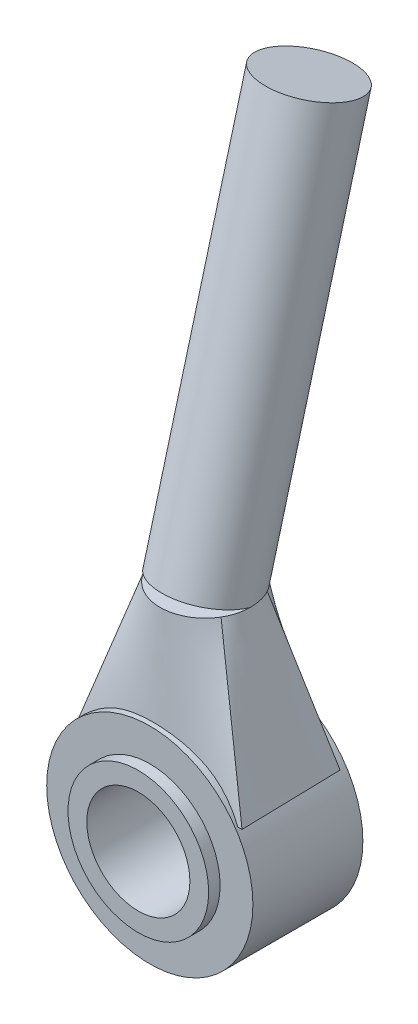
ISO-10303-21;
HEADER;
FILE_DESCRIPTION(('STEP AP214'),'2;1');
FILE_NAME('part.step','',(''),(''),'','','');
FILE_SCHEMA(('AUTOMOTIVE_DESIGN { 1 0 10303 214 1 1 1 1 }'));
ENDSEC;
DATA;
#1=APPLICATION_CONTEXT('core data for automotive mechanical design processes');
#2=APPLICATION_PROTOCOL_DEFINITION('international standard','automotive_design',2000,#1);
#3=PRODUCT_CONTEXT('',#1,'mechanical');
#4=PRODUCT('Part','Part','',(#3));
#5=PRODUCT_RELATED_PRODUCT_CATEGORY('part','',(#4));
#6=PRODUCT_DEFINITION_FORMATION('','',#4);
#7=PRODUCT_DEFINITION_CONTEXT('part definition',#1,'design');
#8=PRODUCT_DEFINITION('design','',#6,#7);
#9=PRODUCT_DEFINITION_SHAPE('','',#8);
#10=(LENGTH_UNIT() NAMED_UNIT(*) SI_UNIT(.MILLI.,.METRE.));
#11=(NAMED_UNIT(*) PLANE_ANGLE_UNIT() SI_UNIT($,.RADIAN.));
#12=(NAMED_UNIT(*) SI_UNIT($,.STERADIAN.) SOLID_ANGLE_UNIT());
#13=UNCERTAINTY_MEASURE_WITH_UNIT(LENGTH_MEASURE(1.E-05),#10,'distance_accuracy_value','');
#14=(GEOMETRIC_REPRESENTATION_CONTEXT(3) GLOBAL_UNCERTAINTY_ASSIGNED_CONTEXT((#13)) GLOBAL_UNIT_ASSIGNED_CONTEXT((#10,
#11,#12)) REPRESENTATION_CONTEXT('',''));
#15=CARTESIAN_POINT('',(0.,0.,0.));
#16=DIRECTION('',(0.,0.,1.));
#17=DIRECTION('',(1.,0.,0.));
#18=AXIS2_PLACEMENT_3D('',#15,#16,#17);
#19=CARTESIAN_POINT('',(-13.8705400464687,10.,1.27208405467628));
#20=CARTESIAN_POINT('',(-6.74020300797196,35.,5.51659180685527));
#21=CARTESIAN_POINT('',(-13.8705400464687,10.,2.7332602371845));
#22=CARTESIAN_POINT('',(-7.0839856706328,35.,6.09243536011873));
#23=CARTESIAN_POINT('',(-13.8705400464687,10.,4.19443641969272));
#24=CARTESIAN_POINT('',(-7.36534175506872,35.,6.73415605144016));
#25=CARTESIAN_POINT('',(-13.8705400464687,10.,7.11678878470916));
#26=CARTESIAN_POINT('',(-7.74869441974719,35.,8.09770033490436));
#27=CARTESIAN_POINT('',(-13.8705400464687,10.,8.57796496721738));
#28=CARTESIAN_POINT('',(-7.85,35.,8.81886912074885));
#29=CARTESIAN_POINT('',(-13.8705400464687,10.,11.5003173322338));
#30=CARTESIAN_POINT('',(-7.85,35.,10.2622119603318));
#31=CARTESIAN_POINT('',(-13.8705400464687,10.,12.961493514742));
#32=CARTESIAN_POINT('',(-7.74869441974719,35.,10.9833807461763));
#33=CARTESIAN_POINT('',(-13.8705400464687,10.,15.8838458797585));
#34=CARTESIAN_POINT('',(-7.36534175506873,35.,12.3469250296405));
#35=CARTESIAN_POINT('',(-13.8705400464687,10.,17.3450220622667));
#36=CARTESIAN_POINT('',(-7.0839856706328,35.,12.988645720962));
#37=CARTESIAN_POINT('',(-13.8705400464687,10.,18.8061982447749));
#38=CARTESIAN_POINT('',(-6.74020300797196,35.,13.5644892742254));
#39=B_SPLINE_SURFACE_WITH_KNOTS('',3,1,((#19,#20),(#21,#22),(#23,#24),(#25,#26),(#27,#28),(#29,
#30),(#31,#32),(#33,#34),(#35,#36),(#37,#38)),.UNSPECIFIED.,.F.,.F.,.F.,(4,2,2,2,4),(2,2),(0.,
0.25,0.5,0.75,1.),(0.,1.),.UNSPECIFIED.);
#40=CARTESIAN_POINT('',(0.,35.,9.54054054054035));
#41=DIRECTION('',(0.,1.,0.));
#42=DIRECTION('',(0.,0.,1.));
#43=AXIS2_PLACEMENT_3D('',#40,#41,#42);
#44=CIRCLE('',#43,7.85);
#45=CARTESIAN_POINT('',(-7.85000000000001,34.9999999999692,9.54054054042548));
#46=VERTEX_POINT('',#45);
#47=CARTESIAN_POINT('',(-6.74020300797196,35.,13.5644892742254));
#48=VERTEX_POINT('',#47);
#49=EDGE_CURVE('E97',#46,#48,#44,.T.);
#50=CARTESIAN_POINT('',(-7.85,35.,9.54054054054045));
#51=CARTESIAN_POINT('',(-7.85000153309476,34.9999925651938,9.45457930350883));
#52=CARTESIAN_POINT('',(-7.84868259635115,34.9995016294931,9.36861990099311));
#53=CARTESIAN_POINT('',(-7.84339141308682,34.9977411085066,9.19679193708648));
#54=CARTESIAN_POINT('',(-7.83941920865064,34.9964715355712,9.11092337427636));
#55=CARTESIAN_POINT('',(-7.82880926834817,34.9933421236728,8.93936391640257));
#56=CARTESIAN_POINT('',(-7.82217160665292,34.9914823011348,8.85367301646179));
#57=CARTESIAN_POINT('',(-7.80622823350151,34.9873062363991,8.6825539797918));
#58=CARTESIAN_POINT('',(-7.79692252101971,34.9849899940259,8.59712584316361));
#59=CARTESIAN_POINT('',(-7.76534462533897,34.9775914227419,8.34409640681349));
#60=CARTESIAN_POINT('',(-7.73923890429636,34.9720013283695,8.17697216787057));
#61=CARTESIAN_POINT('',(-7.67674037133461,34.9598335564832,7.84469716105335));
#62=CARTESIAN_POINT('',(-7.64034749093663,34.9532558723954,7.67954640632363));
#63=CARTESIAN_POINT('',(-7.56923561458058,34.9409997204383,7.39882363345151));
#64=CARTESIAN_POINT('',(-7.53702236720578,34.935603254988,7.28259880679781));
#65=CARTESIAN_POINT('',(-7.46745140621081,34.9245594602166,7.05170221077803));
#66=CARTESIAN_POINT('',(-7.43009344112297,34.9189121186421,6.93703051762835));
#67=CARTESIAN_POINT('',(-7.3503114907877,34.9076504768466,6.70945857720996));
#68=CARTESIAN_POINT('',(-7.30788734559327,34.9020361776745,6.59655838599763));
#69=CARTESIAN_POINT('',(-7.21727411181001,34.8908887126667,6.37079685747549));
#70=CARTESIAN_POINT('',(-7.16899740880983,34.8853586679357,6.25797051567349));
#71=CARTESIAN_POINT('',(-7.06738089454822,34.8745415474123,6.03461018282633));
#72=CARTESIAN_POINT('',(-7.01404111150056,34.8692544702663,5.92407617901142));
#73=CARTESIAN_POINT('',(-6.90239416150728,34.8588694881193,5.70553743359022));
#74=CARTESIAN_POINT('',(-6.84408700692412,34.8537715826476,5.59753268569015));
#75=CARTESIAN_POINT('',(-6.78334400899433,34.8487413680817,5.49091106942482));
#76=B_SPLINE_CURVE_WITH_KNOTS('',3,(#50,#51,#52,#53,#54,#55,#56,#57,#58,#59,#60,#61,#62,#63,#64,
#65,#66,#67,#68,#69,#70,#71,#72,#73,#74,#75),.UNSPECIFIED.,.F.,.F.,(4,2,2,2,2,2,2,2,2,2,2,2,4),
(0.,0.25786944281039,0.515734795546387,0.773592973222185,1.03145125002382,1.53883099821644,
2.04621412397891,2.40828207339649,2.77036772654912,3.13246481431965,3.50087495346038,
3.86928303977443,4.2376902092471),.UNSPECIFIED.);
#77=CARTESIAN_POINT('',(-6.78334400899433,34.8487413680817,5.49091106942482));
#78=VERTEX_POINT('',#77);
#79=EDGE_CURVE('E151',#46,#78,#76,.T.);
#80=DIRECTION('',(-0.270691674593689,-0.949084430133604,-0.161135848846978));
#81=VECTOR('',#80,1.);
#82=CARTESIAN_POINT('',(-10.3053715272203,22.5,3.39433793076577));
#83=LINE('',#82,#81);
#84=CARTESIAN_POINT('',(-13.246779869827,12.1869940133056,1.64339257641407));
#85=VERTEX_POINT('',#84);
#86=EDGE_CURVE('E190',#78,#85,#83,.T.);
#87=CARTESIAN_POINT('',(-13.246779869827,12.1869940133056,18.3476547992516));
#88=CARTESIAN_POINT('',(-13.2699060164804,12.1618471723915,17.6177913229239));
#89=CARTESIAN_POINT('',(-13.2900058665322,12.1398650246041,16.8877213406914));
#90=CARTESIAN_POINT('',(-13.3241170706437,12.1024215895729,15.4272780387758));
#91=CARTESIAN_POINT('',(-13.3381284723978,12.0869602512478,14.6969047215138));
#92=CARTESIAN_POINT('',(-13.3600272609578,12.0627494869134,13.2359516256442));
#93=CARTESIAN_POINT('',(-13.367914636363,12.0540000733993,12.5053718466547));
#94=CARTESIAN_POINT('',(-13.3752695850443,12.0458363772352,11.409437149149));
#95=CARTESIAN_POINT('',(-13.3769752124866,12.0439418858838,11.0441126544063));
#96=CARTESIAN_POINT('',(-13.3788652111911,12.0418423700698,10.3134537069479));
#97=CARTESIAN_POINT('',(-13.3790495786115,12.0416373498739,9.94811925420935));
#98=CARTESIAN_POINT('',(-13.3774299081618,12.0434370928451,8.92093988537307));
#99=CARTESIAN_POINT('',(-13.3738905720119,12.0473704360419,8.25909954271885));
#100=CARTESIAN_POINT('',(-13.3619042598687,12.0606629702632,6.93551360810244));
#101=CARTESIAN_POINT('',(-13.353457243856,12.0700222055328,6.2737680169569));
#102=CARTESIAN_POINT('',(-13.3315398819649,12.0942267667834,4.95042248150654));
#103=CARTESIAN_POINT('',(-13.3180692498606,12.1090724053576,4.28882254765024));
#104=CARTESIAN_POINT('',(-13.2861483655706,12.1440841949889,2.96588960002197));
#105=CARTESIAN_POINT('',(-13.2676981602241,12.1642502960003,2.30455658379793));
#106=CARTESIAN_POINT('',(-13.246779869827,12.1869940133056,1.64339257641407));
#107=B_SPLINE_CURVE_WITH_KNOTS('',3,(#87,#88,#89,#90,#91,#92,#93,#94,#95,#96,#97,#98,#99,#100,
#101,#102,#103,#104,#105,#106),.UNSPECIFIED.,.F.,.F.,(4,2,2,2,2,2,2,2,2,4),(0.,2.19197676462705,
4.3839363578792,6.57590003174947,7.67189441230213,8.76789156070735,10.753431963806,
12.7389885581066,14.7246582989039,16.7103093626434),.UNSPECIFIED.);
#108=CARTESIAN_POINT('',(-13.246779869827,12.1869940133056,18.3476547992516));
#109=VERTEX_POINT('',#108);
#110=EDGE_CURVE('E230',#109,#85,#107,.T.);
#111=DIRECTION('',(0.268865100727587,0.942680196167384,-0.197650209624397));
#112=VECTOR('',#111,1.);
#113=CARTESIAN_POINT('',(-10.3053715272203,22.5,16.1853437595002));
#114=LINE('',#113,#112);
#115=EDGE_CURVE('E181',#109,#48,#114,.T.);
#116=ORIENTED_EDGE('',*,*,#49,.F.);
#117=ORIENTED_EDGE('',*,*,#79,.T.);
#118=ORIENTED_EDGE('',*,*,#86,.T.);
#119=ORIENTED_EDGE('',*,*,#110,.F.);
#120=ORIENTED_EDGE('',*,*,#115,.T.);
#121=EDGE_LOOP('',(#116,#117,#118,#119,#120));
#122=FACE_BOUND('',#121,.T.);
#123=ADVANCED_FACE('F92',(#122),#39,.T.);
#124=CARTESIAN_POINT('',(15.2930447407016,10.,1.27208405467627));
#125=CARTESIAN_POINT('',(6.71491292811593,35.,5.47452967387735));
#126=CARTESIAN_POINT('',(14.0778953745695,10.,1.27208405467627));
#127=CARTESIAN_POINT('',(6.42452590619946,35.,4.99496293596938));
#128=CARTESIAN_POINT('',(12.8627460084374,10.,1.27208405467627));
#129=CARTESIAN_POINT('',(6.06433272429144,35.,4.51663194241364));
#130=CARTESIAN_POINT('',(10.4324472761732,10.,1.27208405467627));
#131=CARTESIAN_POINT('',(5.18979758175801,35.,3.61755226994398));
#132=CARTESIAN_POINT('',(9.2172979100411,10.,1.27208405467627));
#133=CARTESIAN_POINT('',(4.67494659417705,35.,3.19728905884269));
#134=CARTESIAN_POINT('',(6.78699917777691,10.,1.27208405467627));
#135=CARTESIAN_POINT('',(3.50530425502614,35.,2.48328844796474));
#136=CARTESIAN_POINT('',(5.57184981164481,10.,1.27208405467627));
#137=CARTESIAN_POINT('',(2.85045781645197,35.,2.19045960210446));
#138=CARTESIAN_POINT('',(3.14155107938062,10.,1.27208405467627));
#139=CARTESIAN_POINT('',(1.45515567992925,35.,1.79255231700126));
#140=CARTESIAN_POINT('',(1.92640171324852,10.,1.27208405467627));
#141=CARTESIAN_POINT('',(0.715425598823956,35.,1.68826568637504));
#142=CARTESIAN_POINT('',(-0.503897019015668,10.,1.27208405467627));
#143=CARTESIAN_POINT('',(-0.764505239916533,35.,1.69289210862461));
#144=CARTESIAN_POINT('',(-1.71904638514776,10.,1.27208405467627));
#145=CARTESIAN_POINT('',(-1.50356884709799,35.,1.80180160664633));
#146=CARTESIAN_POINT('',(-4.14934511741195,10.,1.27208405467627));
#147=CARTESIAN_POINT('',(-2.89635593534251,35.,2.20842475717079));
#148=CARTESIAN_POINT('',(-5.36449448354405,10.,1.27208405467627));
#149=CARTESIAN_POINT('',(-3.54935876425305,35.,2.50534207986511));
#150=CARTESIAN_POINT('',(-7.79479321580824,10.,1.27208405467627));
#151=CARTESIAN_POINT('',(-4.71451420177967,35.,3.2266415185663));
#152=CARTESIAN_POINT('',(-9.00994258194033,10.,1.27208405467627));
#153=CARTESIAN_POINT('',(-5.22672757674143,35.,3.65011544282675));
#154=CARTESIAN_POINT('',(-11.4402413142045,10.,1.27208405467627));
#155=CARTESIAN_POINT('',(-6.09562444287559,35.,4.55464527041472));
#156=CARTESIAN_POINT('',(-12.6553906803366,10.,1.27208405467627));
#157=CARTESIAN_POINT('',(-6.45281998627376,35.,5.03521889793245));
#158=CARTESIAN_POINT('',(-13.8705400464687,10.,1.27208405467627));
#159=CARTESIAN_POINT('',(-6.74020300797196,35.,5.51659180685527));
#160=B_SPLINE_SURFACE_WITH_KNOTS('',3,1,((#124,#125),(#126,#127),(#128,#129),(#130,#131),(#132,
#133),(#134,#135),(#136,#137),(#138,#139),(#140,#141),(#142,#143),(#144,#145),(#146,#147),(#148,
#149),(#150,#151),(#152,#153),(#154,#155),(#156,#157),(#158,#159)),.UNSPECIFIED.,.F.,.F.,.F.,(4,
2,2,2,2,2,2,2,4),(2,2),(0.,0.125,0.25,0.375,0.5,0.625,0.75,0.875,1.),(0.,1.),.UNSPECIFIED.);
#161=CARTESIAN_POINT('',(-6.78334400899433,34.8487413680817,5.49091106942482));
#162=CARTESIAN_POINT('',(-6.7129250517393,34.8374677655806,5.36874879092934));
#163=CARTESIAN_POINT('',(-6.63917135954371,34.8254681275506,5.24857210741498));
#164=CARTESIAN_POINT('',(-6.48520503038322,34.8000748487916,5.0125871464053));
#165=CARTESIAN_POINT('',(-6.40499254224371,34.7866812401807,4.89677876834451));
#166=CARTESIAN_POINT('',(-6.23831891012205,34.7585580747146,4.66992609017127));
#167=CARTESIAN_POINT('',(-6.15185799323465,34.7438285664069,4.55888161715156));
#168=CARTESIAN_POINT('',(-5.9731746900265,34.7131181430699,4.34223367528796));
#169=CARTESIAN_POINT('',(-5.88096934673867,34.6971408972297,4.23661566263501));
#170=CARTESIAN_POINT('',(-5.73839483979637,34.6722687638123,4.08230173876436));
#171=CARTESIAN_POINT('',(-5.69015708203307,34.6638266836104,4.03154750102834));
#172=CARTESIAN_POINT('',(-5.59229054807799,34.6466253596673,3.93145305724967));
#173=CARTESIAN_POINT('',(-5.54266178679388,34.637866119325,3.88211283606418));
#174=CARTESIAN_POINT('',(-5.39175577464622,34.611201804123,3.7362661823559));
#175=CARTESIAN_POINT('',(-5.28844926688301,34.5929084593648,3.64192344930506));
#176=CARTESIAN_POINT('',(-5.02371508483478,34.546267255857,3.41351645469511));
#177=CARTESIAN_POINT('',(-4.85908557060732,34.5174713319403,3.28321591987219));
#178=CARTESIAN_POINT('',(-4.60447581185032,34.473694218575,3.09859750325529));
#179=CARTESIAN_POINT('',(-4.51831756728823,34.4590028541207,3.03885694347857));
#180=CARTESIAN_POINT('',(-4.34357852534829,34.4295190084823,2.9230563221143));
#181=CARTESIAN_POINT('',(-4.25499778207953,34.4147265295621,2.86699617841568));
#182=CARTESIAN_POINT('',(-3.98577415446524,34.370196775963,2.70445026244457));
#183=CARTESIAN_POINT('',(-3.80169659684927,34.3403152226193,2.60363287683051));
#184=CARTESIAN_POINT('',(-3.42568055410222,34.2824627787481,2.41727061544932));
#185=CARTESIAN_POINT('',(-3.23374182756146,34.2544919469676,2.33172620913509));
#186=CARTESIAN_POINT('',(-2.93890868531112,34.2148762215825,2.21420290789322));
#187=CARTESIAN_POINT('',(-2.83843106865325,34.2019433896085,2.17650513459319));
#188=CARTESIAN_POINT('',(-2.63591582080913,34.177098564772,2.10516253750366));
#189=CARTESIAN_POINT('',(-2.53387818436889,34.1651865753485,2.07151772736752));
#190=CARTESIAN_POINT('',(-2.32842311896587,34.1424459801254,2.00833047345847));
#191=CARTESIAN_POINT('',(-2.22500569041155,34.131617374005,1.97878802847114));
#192=CARTESIAN_POINT('',(-2.01696425389279,34.1110931422892,1.92384607183516));
#193=CARTESIAN_POINT('',(-1.91234024423397,34.1013975182851,1.89844656600509));
#194=CARTESIAN_POINT('',(-1.70207904270748,34.0835231340894,1.85173967710862));
#195=CARTESIAN_POINT('',(-1.59644208468562,34.0753440322624,1.83043137235586));
#196=CARTESIAN_POINT('',(-1.38430940259253,34.0607398829724,1.79187657708686));
#197=CARTESIAN_POINT('',(-1.27781368370016,34.0543148249396,1.77463006209441));
#198=CARTESIAN_POINT('',(-1.06414661364679,34.0433761063527,1.74419079383984));
#199=CARTESIAN_POINT('',(-0.956975262514667,34.0388624457169,1.73099804040452));
#200=CARTESIAN_POINT('',(-0.742144961594269,34.0317953710867,1.70867942555697));
#201=CARTESIAN_POINT('',(-0.634486008645572,34.029241969816,1.69955359054295));
#202=CARTESIAN_POINT('',(-0.417028567761473,34.0260288664148,1.68527593356727));
#203=CARTESIAN_POINT('',(-0.307224954929783,34.0254022682379,1.68019468175157));
#204=CARTESIAN_POINT('',(-0.087507600325852,34.0259370918216,1.6743304946754));
#205=CARTESIAN_POINT('',(0.0224061417486412,34.027098518503,1.67354757124433));
#206=CARTESIAN_POINT('',(0.24214955659078,34.031125530177,1.676302540757));
#207=CARTESIAN_POINT('',(0.351979228483528,34.0339911326694,1.67984047807127));
#208=CARTESIAN_POINT('',(0.571354421042043,34.0415928680074,1.6911835341709));
#209=CARTESIAN_POINT('',(0.680899938788068,34.0463290199971,1.69898869662972));
#210=CARTESIAN_POINT('',(0.899551607669259,34.0576694706601,1.71885293183336));
#211=CARTESIAN_POINT('',(1.00865756650641,34.0642745123806,1.73091369702453));
#212=CARTESIAN_POINT('',(1.22619266651675,34.0792633993065,1.75928500000275));
#213=CARTESIAN_POINT('',(1.33462180296197,34.0876472569236,1.77559556744298));
#214=CARTESIAN_POINT('',(1.55060448819564,34.1059954965475,1.81248334617065));
#215=CARTESIAN_POINT('',(1.65815814553076,34.1159596793795,1.83306001988366));
#216=CARTESIAN_POINT('',(1.8722432341842,34.1372078932905,1.87851426656218));
#217=CARTESIAN_POINT('',(1.97877439609673,34.148492262412,1.90339294186675));
#218=CARTESIAN_POINT('',(2.29611527183495,34.1836279478254,1.98447861063992));
#219=CARTESIAN_POINT('',(2.50514902615387,34.2088056374893,2.04721586392343));
#220=CARTESIAN_POINT('',(2.91690874139129,34.2621322086977,2.18979819896171));
#221=CARTESIAN_POINT('',(3.11963475748994,34.290281064241,2.26964313101013));
#222=CARTESIAN_POINT('',(3.41788976700514,34.3338731068741,2.40199301553313));
#223=CARTESIAN_POINT('',(3.51634831708928,34.3486339431089,2.44821362274253));
#224=CARTESIAN_POINT('',(3.71114116362793,34.3783821382555,2.54481966462852));
#225=CARTESIAN_POINT('',(3.80747600209964,34.3933694376841,2.5952040206655));
#226=CARTESIAN_POINT('',(3.99787038733175,34.4232900321344,2.7001280899877));
#227=CARTESIAN_POINT('',(4.09192984609971,34.4382233250488,2.7546679636358));
#228=CARTESIAN_POINT('',(4.27759308010132,34.4678029103137,2.86785220778663));
#229=CARTESIAN_POINT('',(4.36919669367375,34.4824491837537,2.92649684758126));
#230=CARTESIAN_POINT('',(4.63899232631901,34.5257942701277,3.10769312683887));
#231=CARTESIAN_POINT('',(4.81333339320939,34.5540829617341,3.2361491882556));
#232=CARTESIAN_POINT('',(5.15033207716804,34.6089834211196,3.50793929599426));
#233=CARTESIAN_POINT('',(5.31298807357661,34.6355949562231,3.65127539938731));
#234=CARTESIAN_POINT('',(5.54716018631613,34.6735619163929,3.87655409472302));
#235=CARTESIAN_POINT('',(5.62354949046066,34.6858873119527,3.95332189728461));
#236=CARTESIAN_POINT('',(5.7729680114657,34.709790439927,4.1101713666968));
#237=CARTESIAN_POINT('',(5.84599716184113,34.7213681575495,4.19025309905837));
#238=CARTESIAN_POINT('',(6.05977879949717,34.7550163840053,4.43513034554151));
#239=CARTESIAN_POINT('',(6.19534373232759,34.7760210832108,4.60467179002728));
#240=CARTESIAN_POINT('',(6.40248652659577,34.8075750955697,4.88774436252205));
#241=CARTESIAN_POINT('',(6.47867880414647,34.8190467093011,4.99784507446421));
#242=CARTESIAN_POINT('',(6.6251166402794,34.8408156220694,5.22174770484248));
#243=CARTESIAN_POINT('',(6.69537310800291,34.8511150879936,5.33554227688564));
#244=CARTESIAN_POINT('',(6.76266588551881,34.8608293785693,5.45113539514323));
#245=B_SPLINE_CURVE_WITH_KNOTS('',3,(#161,#162,#163,#164,#165,#166,#167,#168,#169,#170,#171,
#172,#173,#174,#175,#176,#177,#178,#179,#180,#181,#182,#183,#184,#185,#186,#187,#188,#189,#190,
#191,#192,#193,#194,#195,#196,#197,#198,#199,#200,#201,#202,#203,#204,#205,#206,#207,#208,#209,
#210,#211,#212,#213,#214,#215,#216,#217,#218,#219,#220,#221,#222,#223,#224,#225,#226,#227,#228,
#229,#230,#231,#232,#233,#234,#235,#236,#237,#238,#239,#240,#241,#242,#243,#244),.UNSPECIFIED.,
.F.,.F.,(4,2,2,2,2,2,2,2,2,2,2,2,2,2,2,2,2,2,2,2,2,2,2,2,2,2,2,2,2,2,2,2,2,2,2,2,2,2,2,2,2,4),
(0.,0.424315751448831,0.848621728491734,1.27291229217962,1.6959990174827,1.90755783760603,
2.11911439127756,2.54218514826569,3.17709150260921,3.49462050486828,3.81214242056047,
4.44736049059703,5.08259808227668,5.40680013412214,5.73100327808921,6.05520632608332,
6.37940982940227,6.70354020860303,7.02766863455555,7.35179704665911,7.67592756263736,
8.00559662949222,8.33526660362552,8.6649399631391,8.99461669680093,9.32442469042221,
9.65423498535364,9.98400374593708,10.3138571315768,10.9721123511738,11.6303618107275,
11.9595730368394,12.2886992449134,12.6178381605235,12.9469986894668,13.6013069861914,
14.255705857635,14.5826059017187,14.9095124111724,15.5628312164483,15.9658183722183,
16.3680480115527),.UNSPECIFIED.);
#246=CARTESIAN_POINT('',(6.76266588551881,34.8608293785693,5.45113539514323));
#247=VERTEX_POINT('',#246);
#248=EDGE_CURVE('E155',#78,#247,#245,.T.);
#249=DIRECTION('',(-0.320525027202271,0.934134127934485,0.15702591494738));
#250=VECTOR('',#249,1.);
#251=CARTESIAN_POINT('',(11.0039788344088,22.5,3.37330686427681));
#252=LINE('',#251,#250);
#253=CARTESIAN_POINT('',(15.2930447407016,10.,1.27208405467627));
#254=VERTEX_POINT('',#253);
#255=EDGE_CURVE('E326',#254,#247,#252,.T.);
#256=DIRECTION('',(-1.,0.,0.));
#257=VECTOR('',#256,1.);
#258=CARTESIAN_POINT('',(-13.8705400464687,10.,1.27208405467627));
#259=LINE('',#258,#257);
#260=CARTESIAN_POINT('',(14.9666295470958,10.,1.27208405467627));
#261=VERTEX_POINT('',#260);
#262=EDGE_CURVE('E120',#254,#261,#259,.T.);
#263=CARTESIAN_POINT('',(-13.246779869827,12.1869940133056,1.64339257641406));
#264=CARTESIAN_POINT('',(-13.0647988184607,12.384809638748,1.67232977740749));
#265=CARTESIAN_POINT('',(-12.8782080477944,12.578724812337,1.69901194927051));
#266=CARTESIAN_POINT('',(-12.4962349604396,12.9582609542644,1.74754247963683));
#267=CARTESIAN_POINT('',(-12.3008540788877,13.1438832667628,1.76939162379329));
#268=CARTESIAN_POINT('',(-11.9016978832704,13.5063789930432,1.80793919603564));
#269=CARTESIAN_POINT('',(-11.6979237798099,13.6832536605078,1.82463836400508));
#270=CARTESIAN_POINT('',(-11.2824219556192,14.0278219209452,1.8527049429852));
#271=CARTESIAN_POINT('',(-11.0706947219725,14.1955160746308,1.86407267994214));
#272=CARTESIAN_POINT('',(-10.6412801458711,14.5201617150433,1.88136512743625));
#273=CARTESIAN_POINT('',(-10.4236450938603,14.6771803667288,1.8873274975575));
#274=CARTESIAN_POINT('',(-9.98152791668396,14.9813582757912,1.89405362428675));
#275=CARTESIAN_POINT('',(-9.75704608213388,15.1285179507924,1.89481760123574));
#276=CARTESIAN_POINT('',(-9.30176776748708,15.4126283054593,1.89141958034778));
#277=CARTESIAN_POINT('',(-9.07097164171428,15.5495795563669,1.88725785836285));
#278=CARTESIAN_POINT('',(-8.60362282573701,15.812957177946,1.87447912224927));
#279=CARTESIAN_POINT('',(-8.36707098539627,15.9393850904062,1.86586276211434));
#280=CARTESIAN_POINT('',(-7.84947371816993,16.2013306261685,1.84308146293367));
#281=CARTESIAN_POINT('',(-7.56749104551017,16.3349410972196,1.82823851627738));
#282=CARTESIAN_POINT('',(-6.99719018117584,16.5872407983387,1.79462518590405));
#283=CARTESIAN_POINT('',(-6.70887239126166,16.7059309714319,1.77585505060173));
#284=CARTESIAN_POINT('',(-6.12661608622357,16.9281326478269,1.73584435469985));
#285=CARTESIAN_POINT('',(-5.83267755159114,17.0316440984355,1.71460378552457));
#286=CARTESIAN_POINT('',(-5.23969859228173,17.2233188495677,1.67123990154473));
#287=CARTESIAN_POINT('',(-4.94065506604662,17.3114724264833,1.64911603831143));
#288=CARTESIAN_POINT('',(-4.33835032498496,17.4721452541615,1.60554069153363));
#289=CARTESIAN_POINT('',(-4.0350891579785,17.5446646820323,1.58408920037467));
#290=CARTESIAN_POINT('',(-3.42504883830646,17.673886410781,1.54334538005672));
#291=CARTESIAN_POINT('',(-3.11826944212911,17.7305876098481,1.5240532013596));
#292=CARTESIAN_POINT('',(-2.4776845498145,17.8318349932239,1.48766228317152));
#293=CARTESIAN_POINT('',(-2.14365414416504,17.8750714588194,1.47085613586102));
#294=CARTESIAN_POINT('',(-1.47344933552686,17.9427531878216,1.44259158134735));
#295=CARTESIAN_POINT('',(-1.13727481730665,17.9671974325459,1.4311334640616));
#296=CARTESIAN_POINT('',(-0.463941093052427,17.9971753217358,1.41431588445313));
#297=CARTESIAN_POINT('',(-0.126781929941297,18.0027097785605,1.40895616015176));
#298=CARTESIAN_POINT('',(0.547344173006449,17.9948335737295,1.40479159447674));
#299=CARTESIAN_POINT('',(0.884311119466387,17.9814236099369,1.40598651165184));
#300=CARTESIAN_POINT('',(1.55688942712581,17.9357107397312,1.41456256790106));
#301=CARTESIAN_POINT('',(1.89250072973529,17.9034070253568,1.42194397153628));
#302=CARTESIAN_POINT('',(2.5612169472674,17.820036241692,1.44202066714839));
#303=CARTESIAN_POINT('',(2.8943219494969,17.7689698291165,1.45471577314207));
#304=CARTESIAN_POINT('',(3.46386370634955,17.6652285536553,1.48013535872913));
#305=CARTESIAN_POINT('',(3.70117227366203,17.6170344584087,1.49184998437807));
#306=CARTESIAN_POINT('',(4.17357780791925,17.5111353082381,1.51686287732462));
#307=CARTESIAN_POINT('',(4.40867464219422,17.4534296865666,1.53016123897656));
#308=CARTESIAN_POINT('',(5.11007875077462,17.2661868135761,1.57140297330721));
#309=CARTESIAN_POINT('',(5.57261499083814,17.1225025213509,1.60069876423278));
#310=CARTESIAN_POINT('',(6.4846582233043,16.7983194415894,1.65736469930046));
#311=CARTESIAN_POINT('',(6.93416508437626,16.6178202831218,1.68473482403662));
#312=CARTESIAN_POINT('',(7.8175504552332,16.2209812882847,1.73212966693236));
#313=CARTESIAN_POINT('',(8.25142943080453,16.0046425211862,1.75215460417757));
#314=CARTESIAN_POINT('',(8.97147279704984,15.6085392708699,1.77616117124513));
#315=CARTESIAN_POINT('',(9.26245307275081,15.4376428152866,1.78316907482923));
#316=CARTESIAN_POINT('',(9.83445409486006,15.0796987567883,1.79048822148747));
#317=CARTESIAN_POINT('',(10.1154740167368,14.8926498211332,1.79079891144381));
#318=CARTESIAN_POINT('',(10.6665151642699,14.5030798973624,1.7840797638328));
#319=CARTESIAN_POINT('',(10.9365355407751,14.300557718189,1.77704936065382));
#320=CARTESIAN_POINT('',(11.4644339451818,13.8809356086928,1.7554412494574));
#321=CARTESIAN_POINT('',(11.7223188713566,13.6638441346688,1.74086788710341));
#322=CARTESIAN_POINT('',(12.2251860871081,13.2158323191768,1.70433210148163));
#323=CARTESIAN_POINT('',(12.4701693803574,12.9849130564265,1.68237025398027));
#324=CARTESIAN_POINT('',(12.9463520239401,12.510193135545,1.63151008100779));
#325=CARTESIAN_POINT('',(13.177557580505,12.2663983720209,1.60261490861728));
#326=CARTESIAN_POINT('',(13.544206024363,11.8574938661775,1.55018903801514));
#327=CARTESIAN_POINT('',(13.6839338920231,11.6959612477604,1.52852093656197));
#328=CARTESIAN_POINT('',(13.9573665444764,11.36826451826,1.48285313507098));
#329=CARTESIAN_POINT('',(14.0910729691085,11.2021016883362,1.45885407551961));
#330=CARTESIAN_POINT('',(14.3520440559251,10.8657277053625,1.40879889130509));
#331=CARTESIAN_POINT('',(14.4793230480131,10.6955269255246,1.38274770722063));
#332=CARTESIAN_POINT('',(14.7276738335752,10.350882107065,1.32876607945622));
#333=CARTESIAN_POINT('',(14.8487441223522,10.1764370547943,1.30083518397992));
#334=CARTESIAN_POINT('',(14.9666295470958,10.,1.27208405467627));
#335=B_SPLINE_CURVE_WITH_KNOTS('',3,(#263,#264,#265,#266,#267,#268,#269,#270,#271,#272,#273,
#274,#275,#276,#277,#278,#279,#280,#281,#282,#283,#284,#285,#286,#287,#288,#289,#290,#291,#292,
#293,#294,#295,#296,#297,#298,#299,#300,#301,#302,#303,#304,#305,#306,#307,#308,#309,#310,#311,
#312,#313,#314,#315,#316,#317,#318,#319,#320,#321,#322,#323,#324,#325,#326,#327,#328,#329,#330,
#331,#332,#333,#334),.UNSPECIFIED.,.F.,.F.,(4,2,2,2,2,2,2,2,2,2,2,2,2,2,2,2,2,2,2,2,2,2,2,2,2,2,
2,2,2,2,2,2,2,2,2,4),(0.,0.810964679468349,1.62179743211851,2.43251364023246,3.24318027734394,
4.048154539387,4.85309468128344,5.65798974655887,6.46276667723405,7.39946386547077,
8.3361018207333,9.27274302747666,10.2099751163079,11.1471965873429,12.0844833237823,
13.0956202937664,14.1068120712551,15.1179604076823,16.1290714970082,17.1402258280562,
18.1513447709702,18.8784548080878,19.6056081859721,21.0595637694533,22.5135340031059,
23.967460865515,24.9794943191194,25.9916113554762,27.0038063785027,28.0154189019084,
29.0269526110974,30.0380271722583,30.6819254598438,31.3256473188332,31.9678641633135,
32.6102359223726),.UNSPECIFIED.);
#336=EDGE_CURVE('E291',#85,#261,#335,.T.);
#337=ORIENTED_EDGE('',*,*,#86,.F.);
#338=ORIENTED_EDGE('',*,*,#248,.T.);
#339=ORIENTED_EDGE('',*,*,#255,.F.);
#340=ORIENTED_EDGE('',*,*,#262,.T.);
#341=ORIENTED_EDGE('',*,*,#336,.F.);
#342=EDGE_LOOP('',(#337,#338,#339,#340,#341));
#343=FACE_BOUND('',#342,.T.);
#344=ADVANCED_FACE('F213',(#343),#160,.T.);
#345=CARTESIAN_POINT('',(0.,35.,9.54054054054035));
#346=DIRECTION('',(0.,1.,0.));
#347=DIRECTION('',(0.,0.,1.));
#348=AXIS2_PLACEMENT_3D('',#345,#346,#347);
#349=PLANE('',#348);
#350=CARTESIAN_POINT('',(6.76471884319459,35.,13.5231375541143));
#351=VERTEX_POINT('',#350);
#352=CARTESIAN_POINT('',(7.84999841265295,35.,9.54052481270829));
#353=VERTEX_POINT('',#352);
#354=EDGE_CURVE('E174',#351,#353,#44,.T.);
#355=ORIENTED_EDGE('',*,*,#354,.T.);
#356=DIRECTION('',(-1.,0.,-1.56831055310038E-11));
#357=VECTOR('',#356,1.);
#358=CARTESIAN_POINT('',(0.,35.,9.54054054054032));
#359=LINE('',#358,#357);
#360=EDGE_CURVE('E160',#353,#46,#359,.T.);
#361=ORIENTED_EDGE('',*,*,#360,.T.);
#362=ORIENTED_EDGE('',*,*,#49,.T.);
#363=EDGE_CURVE('E185',#48,#351,#44,.T.);
#364=ORIENTED_EDGE('',*,*,#363,.T.);
#365=EDGE_LOOP('',(#355,#361,#362,#364));
#366=FACE_BOUND('',#365,.T.);
#367=ADVANCED_FACE('F170',(#366),#349,.T.);
#368=CARTESIAN_POINT('',(15.7059322733986,10.,18.8061982447749));
#369=CARTESIAN_POINT('',(6.76471884319459,35.,13.5231375541143));
#370=CARTESIAN_POINT('',(15.6715249790071,10.,17.3450220622667));
#371=CARTESIAN_POINT('',(7.10500520658648,35.,12.9451374283989));
#372=CARTESIAN_POINT('',(15.6371176846157,10.,15.8838458797585));
#373=CARTESIAN_POINT('',(7.38245063903609,35.,12.3016266411091));
#374=CARTESIAN_POINT('',(15.5683030958329,10.,12.961493514742));
#375=CARTESIAN_POINT('',(7.75744973328877,35.,10.9355844567152));
#376=CARTESIAN_POINT('',(15.5338958014415,10.,11.5003173322338));
#377=CARTESIAN_POINT('',(7.85431598120922,35.,10.2137124595819));
#378=CARTESIAN_POINT('',(15.4650812126587,10.,8.57796496721735));
#379=CARTESIAN_POINT('',(7.8453834267392,35.,8.77021667831709));
#380=CARTESIAN_POINT('',(15.4306739182672,10.,7.11678878470913));
#381=CARTESIAN_POINT('',(7.73959084880263,35.,8.04959876243864));
#382=CARTESIAN_POINT('',(15.3618593294844,10.,4.1944364196927));
#383=CARTESIAN_POINT('',(7.34771459908349,35.,6.68830211029405));
#384=CARTESIAN_POINT('',(15.327452035093,10.,2.73326023718448));
#385=CARTESIAN_POINT('',(7.06232644914577,35.,6.0482742161983));
#386=CARTESIAN_POINT('',(15.2930447407016,10.,1.27208405467627));
#387=CARTESIAN_POINT('',(6.71491292811593,35.,5.47452967387735));
#388=B_SPLINE_SURFACE_WITH_KNOTS('',3,1,((#368,#369),(#370,#371),(#372,#373),(#374,#375),(#376,
#377),(#378,#379),(#380,#381),(#382,#383),(#384,#385),(#386,#387)),.UNSPECIFIED.,.F.,.F.,.F.,(4,
2,2,2,4),(2,2),(0.,0.25,0.5,0.75,1.),(0.,1.),.UNSPECIFIED.);
#389=CARTESIAN_POINT('',(6.76266588551881,34.8608293785693,5.45113539514323));
#390=CARTESIAN_POINT('',(6.8059887043484,34.8643570680878,5.52628359434478));
#391=CARTESIAN_POINT('',(6.84809387543403,34.8678938689502,5.60212588489482));
#392=CARTESIAN_POINT('',(6.9298392753887,34.8750120568546,5.75512497923483));
#393=CARTESIAN_POINT('',(6.96947951546309,34.8785934436937,5.83228177704714));
#394=CARTESIAN_POINT('',(7.08464514025691,34.8894427757173,6.06558649931942));
#395=CARTESIAN_POINT('',(7.15643102656871,34.8968171417662,6.22359582371163));
#396=CARTESIAN_POINT('',(7.28864514239939,34.911638319656,6.54124806287179));
#397=CARTESIAN_POINT('',(7.34923971812875,34.9190819812917,6.70082215081009));
#398=CARTESIAN_POINT('',(7.46026970374586,34.9337775125106,7.02347938338696));
#399=CARTESIAN_POINT('',(7.51070502397647,34.9410293804007,7.18656255897977));
#400=CARTESIAN_POINT('',(7.60447436447894,34.9549322580171,7.52746856769864));
#401=CARTESIAN_POINT('',(7.64703625994639,34.9615024839082,7.70550761351301));
#402=CARTESIAN_POINT('',(7.72015635269432,34.9734602961088,8.06407747519324));
#403=CARTESIAN_POINT('',(7.75071365681475,34.9788477944084,8.24460847543035));
#404=CARTESIAN_POINT('',(7.80019431246104,34.9883306138772,8.61058784926945));
#405=CARTESIAN_POINT('',(7.81890068929714,34.9924012029904,8.79606652788089));
#406=CARTESIAN_POINT('',(7.83757831582155,34.9967965855828,9.07490350109315));
#407=CARTESIAN_POINT('',(7.84224053360021,34.9979766435986,9.16795634341008));
#408=CARTESIAN_POINT('',(7.84845164171373,34.9995891524105,9.35417303780581));
#409=CARTESIAN_POINT('',(7.85000050431175,35.0000215965462,9.4473368908662));
#410=CARTESIAN_POINT('',(7.84999999993245,34.999991570999,9.54050908308017));
#411=B_SPLINE_CURVE_WITH_KNOTS('',3,(#389,#390,#391,#392,#393,#394,#395,#396,#397,#398,#399,
#400,#401,#402,#403,#404,#405,#406,#407,#408,#409,#410),.UNSPECIFIED.,.F.,.F.,(4,2,2,2,2,2,2,2,
2,2,4),(0.,0.260416098712317,0.520831013512274,1.04156721481255,1.55379871131135,
2.06603472814053,2.6151294289914,3.16426497559771,3.72318413694614,4.00266781880652,
4.28215399057385),.UNSPECIFIED.);
#412=EDGE_CURVE('E13',#247,#353,#411,.T.);
#413=DIRECTION('',(-0.330283691235495,0.923486766683638,-0.195153465416465));
#414=VECTOR('',#413,1.);
#415=CARTESIAN_POINT('',(11.2353255582966,22.5,16.1646678994446));
#416=LINE('',#415,#414);
#417=CARTESIAN_POINT('',(15.7059322733986,10.,18.8061982447749));
#418=VERTEX_POINT('',#417);
#419=EDGE_CURVE('E313',#418,#351,#416,.T.);
#420=DIRECTION('',(-0.023541144093845,0.,-0.999722868866544));
#421=VECTOR('',#420,1.);
#422=CARTESIAN_POINT('',(15.2930447407016,10.,1.27208405467627));
#423=LINE('',#422,#421);
#424=EDGE_CURVE('E334',#418,#254,#423,.T.);
#425=ORIENTED_EDGE('',*,*,#255,.T.);
#426=ORIENTED_EDGE('',*,*,#412,.T.);
#427=ORIENTED_EDGE('',*,*,#354,.F.);
#428=ORIENTED_EDGE('',*,*,#419,.F.);
#429=ORIENTED_EDGE('',*,*,#424,.T.);
#430=EDGE_LOOP('',(#425,#426,#427,#428,#429));
#431=FACE_BOUND('',#430,.T.);
#432=ADVANCED_FACE('F270',(#431),#388,.T.);
#433=CARTESIAN_POINT('',(0.,0.,19.2));
#434=DIRECTION('',(0.,0.,-1.));
#435=DIRECTION('',(-1.,0.,0.));
#436=AXIS2_PLACEMENT_3D('',#433,#434,#435);
#437=CYLINDRICAL_SURFACE('',#436,18.);
#438=DIRECTION('',(0.,0.,-1.));
#439=VECTOR('',#438,1.);
#440=CARTESIAN_POINT('',(14.9666295470958,10.,19.2));
#441=LINE('',#440,#439);
#442=CARTESIAN_POINT('',(14.9666295470958,10.,18.8061982447749));
#443=VERTEX_POINT('',#442);
#444=EDGE_CURVE('E430',#261,#443,#441,.F.);
#445=ORIENTED_EDGE('',*,*,#444,.T.);
#446=CARTESIAN_POINT('',(14.9666295470958,10.,18.8061982447749));
#447=CARTESIAN_POINT('',(14.8133144860924,10.2294679410257,18.7603700914276));
#448=CARTESIAN_POINT('',(14.654572567295,10.455620100046,18.7160378214415));
#449=CARTESIAN_POINT('',(14.3264172458381,10.9009299358218,18.6308629979439));
#450=CARTESIAN_POINT('',(14.1569977119137,11.1200834830178,18.5900224817623));
#451=CARTESIAN_POINT('',(13.8078006431749,11.5508241514115,18.5123729756132));
#452=CARTESIAN_POINT('',(13.6280203265018,11.7624092155323,18.4755650761674));
#453=CARTESIAN_POINT('',(13.2584599049455,12.1774567148322,18.4064673280716));
#454=CARTESIAN_POINT('',(13.0686791401777,12.3809186124391,18.3741777780822));
#455=CARTESIAN_POINT('',(12.6809528348143,12.7777072932433,18.3147533725788));
#456=CARTESIAN_POINT('',(12.483078617705,12.9710982662264,18.2875819226441));
#457=CARTESIAN_POINT('',(12.0783172777795,13.3488149492244,18.2384136345467));
#458=CARTESIAN_POINT('',(11.8714320066549,13.533142505272,18.2164157391548));
#459=CARTESIAN_POINT('',(11.4491220705738,13.8922427707054,18.177782690415));
#460=CARTESIAN_POINT('',(11.2336992587357,14.0670175341926,18.1611463803883));
#461=CARTESIAN_POINT('',(10.794830840002,14.4065467261875,18.1332757024736));
#462=CARTESIAN_POINT('',(10.5713867792461,14.5713030694817,18.1220402994762));
#463=CARTESIAN_POINT('',(10.0818703586948,14.915046403632,18.1035005132208));
#464=CARTESIAN_POINT('',(9.81454493289688,15.0923001701038,18.0970714795718));
#465=CARTESIAN_POINT('',(9.27075467077879,15.4323020228525,18.0907057835227));
#466=CARTESIAN_POINT('',(8.99428969549566,15.5950498884341,18.0907692198831));
#467=CARTESIAN_POINT('',(8.43311295852987,15.9055157689389,18.0965247696403));
#468=CARTESIAN_POINT('',(8.1484013163115,16.0532340014473,18.1022168015386));
#469=CARTESIAN_POINT('',(7.57133010658622,16.3333379704647,18.1180755446455));
#470=CARTESIAN_POINT('',(7.27896358347916,16.4657091241271,18.1282464683976));
#471=CARTESIAN_POINT('',(6.68768355401883,16.7145978023708,18.1516229695036));
#472=CARTESIAN_POINT('',(6.38877006964876,16.8311153801752,18.1648285366692));
#473=CARTESIAN_POINT('',(5.78519582220216,17.0480014097374,18.1927462436699));
#474=CARTESIAN_POINT('',(5.48053476525702,17.1483690332477,18.20745846071));
#475=CARTESIAN_POINT('',(4.86013270240625,17.3345345201584,18.2370997164898));
#476=CARTESIAN_POINT('',(4.54429198087743,17.4200005247627,18.2520272004424));
#477=CARTESIAN_POINT('',(3.90835257108015,17.5736103217674,18.2800975835889));
#478=CARTESIAN_POINT('',(3.58825397679136,17.6417544958294,18.2932405220997));
#479=CARTESIAN_POINT('',(2.94470645791877,17.7605113632734,18.3163231058537));
#480=CARTESIAN_POINT('',(2.62125757373276,17.8111242677945,18.3262627896754));
#481=CARTESIAN_POINT('',(1.97228209314377,17.8946090733677,18.3419146545634));
#482=CARTESIAN_POINT('',(1.646757741943,17.9274976479708,18.3476308106526));
#483=CARTESIAN_POINT('',(0.994344653105458,17.9754907811135,18.354033255977));
#484=CARTESIAN_POINT('',(0.667455891472291,17.9905950255395,18.3547194563722));
#485=CARTESIAN_POINT('',(0.0133774699039383,18.0029664255722,18.3507076551307));
#486=CARTESIAN_POINT('',(-0.313812177795874,18.0002342769739,18.3460098635285));
#487=CARTESIAN_POINT('',(-0.887857926564736,17.9797923401344,18.3333510705578));
#488=CARTESIAN_POINT('',(-1.13488160112197,17.9658903294,18.3264627701223));
#489=CARTESIAN_POINT('',(-1.62805839839404,17.9279275583545,18.3100780659272));
#490=CARTESIAN_POINT('',(-1.87421154029521,17.9038670233594,18.3005817200157));
#491=CARTESIAN_POINT('',(-2.36524264245413,17.8456368645595,18.2793277981125));
#492=CARTESIAN_POINT('',(-2.61012049622033,17.8114664098855,18.2675700362974));
#493=CARTESIAN_POINT('',(-3.09815469951661,17.7330914617373,18.2423308792137));
#494=CARTESIAN_POINT('',(-3.34131108140199,17.6888871573697,18.2288495164317));
#495=CARTESIAN_POINT('',(-4.0682662795861,17.5412052460266,18.186801061726));
#496=CARTESIAN_POINT('',(-4.54900925759931,17.4227229808681,18.1566558096567));
#497=CARTESIAN_POINT('',(-5.49918107578865,17.1465389583707,18.0980632804048));
#498=CARTESIAN_POINT('',(-5.96861002213586,16.9888375692221,18.0696159872849));
#499=CARTESIAN_POINT('',(-6.74513246235878,16.6918072142086,18.028536357742));
#500=CARTESIAN_POINT('',(-7.05607933381466,16.562762303532,18.0137566618819));
#501=CARTESIAN_POINT('',(-7.67045288585303,16.2873404174976,17.9896716420783));
#502=CARTESIAN_POINT('',(-7.97387942428233,16.1409631148157,17.9803664215407));
#503=CARTESIAN_POINT('',(-8.57217527206216,15.8313385537687,17.9687182304545));
#504=CARTESIAN_POINT('',(-8.86704385246975,15.668089863716,17.9663758512679));
#505=CARTESIAN_POINT('',(-9.4465337265308,15.3256655842633,17.9697577187621));
#506=CARTESIAN_POINT('',(-9.73117472662221,15.1465232185058,17.9754654933494));
#507=CARTESIAN_POINT('',(-10.2897440941228,14.7727483229684,17.9955463248839));
#508=CARTESIAN_POINT('',(-10.5636733164628,14.5781170331726,18.0099186887817));
#509=CARTESIAN_POINT('',(-11.0996961014139,14.1742467917575,18.0475180578085));
#510=CARTESIAN_POINT('',(-11.3617961267707,13.9650159794891,18.0707401608521));
#511=CARTESIAN_POINT('',(-11.7618193429879,13.6270061445882,18.1138292585906));
#512=CARTESIAN_POINT('',(-11.9040631387491,13.5029204942351,18.1307452459335));
#513=CARTESIAN_POINT('',(-12.1843584632493,13.2505455378629,18.1672452397213));
#514=CARTESIAN_POINT('',(-12.3224111025876,13.1222573645228,18.1868285316857));
#515=CARTESIAN_POINT('',(-12.5940805659672,12.8617462332234,18.2285426630256));
#516=CARTESIAN_POINT('',(-12.7277017438437,12.7295273948849,18.2506709003824));
#517=CARTESIAN_POINT('',(-12.9905649177639,12.4611605657487,18.2973665172691));
#518=CARTESIAN_POINT('',(-13.1198058617212,12.325011645325,18.3219344773033));
#519=CARTESIAN_POINT('',(-13.2467798698269,12.1869940133056,18.3476547992516));
#520=B_SPLINE_CURVE_WITH_KNOTS('',3,(#446,#447,#448,#449,#450,#451,#452,#453,#454,#455,#456,
#457,#458,#459,#460,#461,#462,#463,#464,#465,#466,#467,#468,#469,#470,#471,#472,#473,#474,#475,
#476,#477,#478,#479,#480,#481,#482,#483,#484,#485,#486,#487,#488,#489,#490,#491,#492,#493,#494,
#495,#496,#497,#498,#499,#500,#501,#502,#503,#504,#505,#506,#507,#508,#509,#510,#511,#512,#513,
#514,#515,#516,#517,#518,#519),.UNSPECIFIED.,.F.,.F.,(4,2,2,2,2,2,2,2,2,2,2,2,2,2,2,2,2,2,2,2,2,
2,2,2,2,2,2,2,2,2,2,2,2,2,2,2,4),(0.,0.839194348320639,1.6788750456755,2.51878225637413,
3.35874495834272,4.19245279620038,5.02599011537938,5.85934749126076,6.69254508649204,
7.65445090757267,8.61637136075703,9.57827788616378,10.5410910546886,11.5039009908034,
12.4667602887301,13.4488931712401,14.4310044119892,15.4131038241969,16.3942777404483,
17.3754689863021,18.3566219562571,19.0989407657891,19.8412431115454,20.5836064792979,
21.3259558569902,22.8122885007049,24.2986071912119,25.3090409850778,26.3194938641373,
27.3300325596467,28.33850650466,29.3468997961638,30.3547353241347,30.9231900167339,
31.4914927379673,32.0592194923634,32.6270816560626),.UNSPECIFIED.);
#521=EDGE_CURVE('E104',#443,#109,#520,.T.);
#522=ORIENTED_EDGE('',*,*,#521,.T.);
#523=ORIENTED_EDGE('',*,*,#110,.T.);
#524=ORIENTED_EDGE('',*,*,#336,.T.);
#525=EDGE_LOOP('',(#445,#522,#523,#524));
#526=FACE_BOUND('',#525,.T.);
#527=CARTESIAN_POINT('',(0.,0.,19.2));
#528=DIRECTION('',(0.,0.,1.));
#529=DIRECTION('',(1.,0.,0.));
#530=AXIS2_PLACEMENT_3D('',#527,#528,#529);
#531=CIRCLE('',#530,18.);
#532=CARTESIAN_POINT('',(18.,0.,19.2));
#533=VERTEX_POINT('',#532);
#534=EDGE_CURVE('E295',#533,#533,#531,.T.);
#535=ORIENTED_EDGE('',*,*,#534,.F.);
#536=EDGE_LOOP('',(#535));
#537=FACE_BOUND('',#536,.T.);
#538=CARTESIAN_POINT('',(0.,0.,0.));
#539=DIRECTION('',(0.,0.,1.));
#540=DIRECTION('',(1.,0.,0.));
#541=AXIS2_PLACEMENT_3D('',#538,#539,#540);
#542=CIRCLE('',#541,18.);
#543=CARTESIAN_POINT('',(18.,0.,0.));
#544=VERTEX_POINT('',#543);
#545=EDGE_CURVE('E296',#544,#544,#542,.T.);
#546=ORIENTED_EDGE('',*,*,#545,.T.);
#547=EDGE_LOOP('',(#546));
#548=FACE_BOUND('',#547,.T.);
#549=ADVANCED_FACE('F94',(#526,#537,#548),#437,.T.);
#550=CARTESIAN_POINT('',(0.,0.,19.2));
#551=DIRECTION('',(0.,0.,1.));
#552=DIRECTION('',(1.,0.,0.));
#553=AXIS2_PLACEMENT_3D('',#550,#551,#552);
#554=PLANE('',#553);
#555=CARTESIAN_POINT('',(0.,0.,19.2));
#556=DIRECTION('',(0.,0.,1.));
#557=DIRECTION('',(1.,0.,0.));
#558=AXIS2_PLACEMENT_3D('',#555,#556,#557);
#559=CIRCLE('',#558,12.2764584324514);
#560=CARTESIAN_POINT('',(12.2764584324514,0.,19.2));
#561=VERTEX_POINT('',#560);
#562=EDGE_CURVE('E184',#561,#561,#559,.T.);
#563=ORIENTED_EDGE('',*,*,#562,.F.);
#564=EDGE_LOOP('',(#563));
#565=FACE_BOUND('',#564,.T.);
#566=ORIENTED_EDGE('',*,*,#534,.T.);
#567=EDGE_LOOP('',(#566));
#568=FACE_BOUND('',#567,.T.);
#569=ADVANCED_FACE('F416',(#565,#568),#554,.T.);
#570=CARTESIAN_POINT('',(0.,0.,0.));
#571=DIRECTION('',(0.,0.,1.));
#572=DIRECTION('',(1.,0.,0.));
#573=AXIS2_PLACEMENT_3D('',#570,#571,#572);
#574=PLANE('',#573);
#575=CARTESIAN_POINT('',(0.,0.,0.));
#576=DIRECTION('',(0.,0.,-1.));
#577=DIRECTION('',(-1.,0.,0.));
#578=AXIS2_PLACEMENT_3D('',#575,#576,#577);
#579=CIRCLE('',#578,9.);
#580=CARTESIAN_POINT('',(-9.,0.,0.));
#581=VERTEX_POINT('',#580);
#582=EDGE_CURVE('E177',#581,#581,#579,.T.);
#583=ORIENTED_EDGE('',*,*,#582,.F.);
#584=EDGE_LOOP('',(#583));
#585=FACE_BOUND('',#584,.T.);
#586=ORIENTED_EDGE('',*,*,#545,.F.);
#587=EDGE_LOOP('',(#586));
#588=FACE_BOUND('',#587,.T.);
#589=ADVANCED_FACE('F413',(#585,#588),#574,.F.);
#590=CARTESIAN_POINT('',(0.,0.,21.2));
#591=DIRECTION('',(0.,0.,1.));
#592=DIRECTION('',(1.,0.,0.));
#593=AXIS2_PLACEMENT_3D('',#590,#591,#592);
#594=PLANE('',#593);
#595=CARTESIAN_POINT('',(0.,0.,21.2));
#596=DIRECTION('',(0.,0.,1.));
#597=DIRECTION('',(1.,0.,0.));
#598=AXIS2_PLACEMENT_3D('',#595,#596,#597);
#599=CIRCLE('',#598,9.);
#600=CARTESIAN_POINT('',(9.,0.,21.2));
#601=VERTEX_POINT('',#600);
#602=EDGE_CURVE('E401',#601,#601,#599,.T.);
#603=ORIENTED_EDGE('',*,*,#602,.F.);
#604=EDGE_LOOP('',(#603));
#605=FACE_BOUND('',#604,.T.);
#606=CARTESIAN_POINT('',(0.,0.,21.2));
#607=DIRECTION('',(0.,0.,1.));
#608=DIRECTION('',(1.,0.,0.));
#609=AXIS2_PLACEMENT_3D('',#606,#607,#608);
#610=CIRCLE('',#609,12.2764584324514);
#611=CARTESIAN_POINT('',(12.2764584324514,0.,21.2));
#612=VERTEX_POINT('',#611);
#613=EDGE_CURVE('E300',#612,#612,#610,.T.);
#614=ORIENTED_EDGE('',*,*,#613,.T.);
#615=EDGE_LOOP('',(#614));
#616=FACE_BOUND('',#615,.T.);
#617=ADVANCED_FACE('F372',(#605,#616),#594,.T.);
#618=CARTESIAN_POINT('',(0.,0.,21.2));
#619=DIRECTION('',(0.,0.,-1.));
#620=DIRECTION('',(-1.,0.,0.));
#621=AXIS2_PLACEMENT_3D('',#618,#619,#620);
#622=CYLINDRICAL_SURFACE('',#621,12.2764584324514);
#623=ORIENTED_EDGE('',*,*,#613,.F.);
#624=EDGE_LOOP('',(#623));
#625=FACE_BOUND('',#624,.T.);
#626=ORIENTED_EDGE('',*,*,#562,.T.);
#627=EDGE_LOOP('',(#626));
#628=FACE_BOUND('',#627,.T.);
#629=ADVANCED_FACE('F463',(#625,#628),#622,.T.);
#630=CARTESIAN_POINT('',(0.,10.,0.));
#631=DIRECTION('',(0.,-1.,0.));
#632=DIRECTION('',(0.,0.,-1.));
#633=AXIS2_PLACEMENT_3D('',#630,#631,#632);
#634=PLANE('',#633);
#635=ORIENTED_EDGE('',*,*,#444,.F.);
#636=ORIENTED_EDGE('',*,*,#262,.F.);
#637=ORIENTED_EDGE('',*,*,#424,.F.);
#638=DIRECTION('',(1.,0.,0.));
#639=VECTOR('',#638,1.);
#640=CARTESIAN_POINT('',(15.7059322733986,10.,18.8061982447749));
#641=LINE('',#640,#639);
#642=EDGE_CURVE('E388',#443,#418,#641,.T.);
#643=ORIENTED_EDGE('',*,*,#642,.F.);
#644=EDGE_LOOP('',(#635,#636,#637,#643));
#645=FACE_BOUND('',#644,.T.);
#646=ADVANCED_FACE('F214',(#645),#634,.T.);
#647=CARTESIAN_POINT('',(-13.8705400464687,10.,18.8061982447749));
#648=CARTESIAN_POINT('',(-6.74020300797196,35.,13.5644892742254));
#649=CARTESIAN_POINT('',(-12.6381870331409,10.,18.8061982447749));
#650=CARTESIAN_POINT('',(-6.45175625673588,35.,14.0476439536193));
#651=CARTESIAN_POINT('',(-11.4058340198131,10.,18.8061982447749));
#652=CARTESIAN_POINT('',(-6.09284753525384,35.,14.5302245969364));
#653=CARTESIAN_POINT('',(-8.94112799315749,10.,18.8061982447749));
#654=CARTESIAN_POINT('',(-5.21869677155486,35.,15.4384166054526));
#655=CARTESIAN_POINT('',(-7.70877497982969,10.,18.8061982447749));
#656=CARTESIAN_POINT('',(-4.70292304684318,35.,15.8635361414842));
#657=CARTESIAN_POINT('',(-5.24406895317408,10.,18.8061982447749));
#658=CARTESIAN_POINT('',(-3.52886032330848,35.,16.5864544892529));
#659=CARTESIAN_POINT('',(-4.01171593984628,10.,18.8061982447749));
#660=CARTESIAN_POINT('',(-2.87050405255864,35.,16.8833154530183));
#661=CARTESIAN_POINT('',(-1.54700991319067,10.,18.8061982447749));
#662=CARTESIAN_POINT('',(-1.4663414149619,35.,17.2868932168545));
#663=CARTESIAN_POINT('',(-0.314656899862869,10.,18.8061982447749));
#664=CARTESIAN_POINT('',(-0.721281455519524,35.,17.3927858851096));
#665=CARTESIAN_POINT('',(2.15004912679274,10.,18.8061982447749));
#666=CARTESIAN_POINT('',(0.769354222579618,35.,17.3882215973612));
#667=CARTESIAN_POINT('',(3.38240214012054,10.,18.8061982447749));
#668=CARTESIAN_POINT('',(1.51375173613558,35.,17.2777682489911));
#669=CARTESIAN_POINT('',(5.84710816677614,10.,18.8061982447749));
#670=CARTESIAN_POINT('',(2.91541657790625,35.,16.8655991142543));
#671=CARTESIAN_POINT('',(7.07946118010394,10.,18.8061982447749));
#672=CARTESIAN_POINT('',(3.57194255960558,35.,16.5647120151672));
#673=CARTESIAN_POINT('',(9.54416720675955,10.,18.8061982447749));
#674=CARTESIAN_POINT('',(4.74155619514215,35.,15.8346173912304));
#675=CARTESIAN_POINT('',(10.7765202200874,10.,18.8061982447749));
#676=CARTESIAN_POINT('',(5.2547168629232,35.,15.4063472848009));
#677=CARTESIAN_POINT('',(13.241226246743,10.,18.8061982447749));
#678=CARTESIAN_POINT('',(6.12328956669031,35.,14.4928191022696));
#679=CARTESIAN_POINT('',(14.4735792600708,10.,18.8061982447749));
#680=CARTESIAN_POINT('',(6.47923628710947,35.,14.0080495901476));
#681=CARTESIAN_POINT('',(15.7059322733986,10.,18.8061982447749));
#682=CARTESIAN_POINT('',(6.76471884319459,35.,13.5231375541143));
#683=B_SPLINE_SURFACE_WITH_KNOTS('',3,1,((#647,#648),(#649,#650),(#651,#652),(#653,#654),(#655,
#656),(#657,#658),(#659,#660),(#661,#662),(#663,#664),(#665,#666),(#667,#668),(#669,#670),(#671,
#672),(#673,#674),(#675,#676),(#677,#678),(#679,#680),(#681,#682)),.UNSPECIFIED.,.F.,.F.,.F.,(4,
2,2,2,2,2,2,2,4),(2,2),(0.,0.125,0.25,0.375,0.5,0.625,0.75,0.875,1.),(0.,1.),.UNSPECIFIED.);
#684=ORIENTED_EDGE('',*,*,#521,.F.);
#685=ORIENTED_EDGE('',*,*,#642,.T.);
#686=ORIENTED_EDGE('',*,*,#419,.T.);
#687=ORIENTED_EDGE('',*,*,#363,.F.);
#688=ORIENTED_EDGE('',*,*,#115,.F.);
#689=EDGE_LOOP('',(#684,#685,#686,#687,#688));
#690=FACE_BOUND('',#689,.T.);
#691=ADVANCED_FACE('F217',(#690),#683,.T.);
#692=CARTESIAN_POINT('',(0.,0.,50.));
#693=DIRECTION('',(0.,0.,-1.));
#694=DIRECTION('',(-1.,0.,0.));
#695=AXIS2_PLACEMENT_3D('',#692,#693,#694);
#696=CYLINDRICAL_SURFACE('',#695,9.);
#697=ORIENTED_EDGE('',*,*,#602,.T.);
#698=EDGE_LOOP('',(#697));
#699=FACE_BOUND('',#698,.T.);
#700=ORIENTED_EDGE('',*,*,#582,.T.);
#701=EDGE_LOOP('',(#700));
#702=FACE_BOUND('',#701,.T.);
#703=ADVANCED_FACE('F250',(#699,#702),#696,.F.);
#704=CARTESIAN_POINT('',(1.27204178612295E-10,30.2703094267465,-8.11090497101014));
#705=DIRECTION('',(4.05908640033203E-12,0.965925826245406,-0.258819045265472));
#706=DIRECTION('',(0.,0.258819045265472,0.965925826245406));
#707=AXIS2_PLACEMENT_3D('',#704,#705,#706);
#708=PLANE('',#707);
#709=ORIENTED_EDGE('',*,*,#360,.F.);
#710=CARTESIAN_POINT('',(0.,35.,9.54054054054035));
#711=DIRECTION('',(0.,-0.965925826289069,0.258819045102518));
#712=DIRECTION('',(0.,-0.258819045102518,-0.965925826289069));
#713=AXIS2_PLACEMENT_3D('',#710,#711,#712);
#714=CIRCLE('',#713,7.85000000000001);
#715=EDGE_CURVE('E112',#353,#46,#714,.T.);
#716=ORIENTED_EDGE('',*,*,#715,.T.);
#717=EDGE_LOOP('',(#709,#716));
#718=FACE_BOUND('',#717,.T.);
#719=ADVANCED_FACE('F164',(#718),#708,.F.);
#720=CARTESIAN_POINT('',(1.2671906852852E-10,97.8851172669814,-26.2282381281864));
#721=DIRECTION('',(4.05908640033203E-12,0.965925826245406,-0.258819045265472));
#722=DIRECTION('',(0.,0.258819045265472,0.965925826245406));
#723=AXIS2_PLACEMENT_3D('',#720,#721,#722);
#724=PLANE('',#723);
#725=CARTESIAN_POINT('',(-4.85110083774831E-13,102.614807840235,-8.57679261663589));
#726=DIRECTION('',(0.,-0.965925826289069,0.258819045102518));
#727=DIRECTION('',(0.,-0.258819045102518,-0.965925826289069));
#728=AXIS2_PLACEMENT_3D('',#725,#726,#727);
#729=CIRCLE('',#728,7.85000000000001);
#730=CARTESIAN_POINT('',(-4.85110083774831E-13,100.58307833618,-16.1593103530051));
#731=VERTEX_POINT('',#730);
#732=EDGE_CURVE('E166',#731,#731,#729,.T.);
#733=ORIENTED_EDGE('',*,*,#732,.F.);
#734=EDGE_LOOP('',(#733));
#735=FACE_BOUND('',#734,.T.);
#736=ADVANCED_FACE('F249',(#735),#724,.T.);
#737=CARTESIAN_POINT('',(0.,35.,9.54054054054035));
#738=DIRECTION('',(0.,0.965925826289069,-0.258819045102518));
#739=DIRECTION('',(0.,0.258819045102518,0.965925826289069));
#740=AXIS2_PLACEMENT_3D('',#737,#738,#739);
#741=CYLINDRICAL_SURFACE('',#740,7.85000000000001);
#742=ORIENTED_EDGE('',*,*,#79,.F.);
#743=ORIENTED_EDGE('',*,*,#715,.F.);
#744=ORIENTED_EDGE('',*,*,#412,.F.);
#745=ORIENTED_EDGE('',*,*,#248,.F.);
#746=EDGE_LOOP('',(#742,#743,#744,#745));
#747=FACE_BOUND('',#746,.T.);
#748=ORIENTED_EDGE('',*,*,#732,.T.);
#749=EDGE_LOOP('',(#748));
#750=FACE_BOUND('',#749,.T.);
#751=ADVANCED_FACE('F152',(#747,#750),#741,.T.);
#752=CLOSED_SHELL('',(#123,#344,#367,#432,#549,#569,#589,#617,#629,#646,#691,#703,#719,#736,#751));
#753=MANIFOLD_SOLID_BREP('B2',#752);
#754=ADVANCED_BREP_SHAPE_REPRESENTATION('',(#18,#753),#14);
#755=SHAPE_DEFINITION_REPRESENTATION(#9,#754);
ENDSEC;
END-ISO-10303-21;
